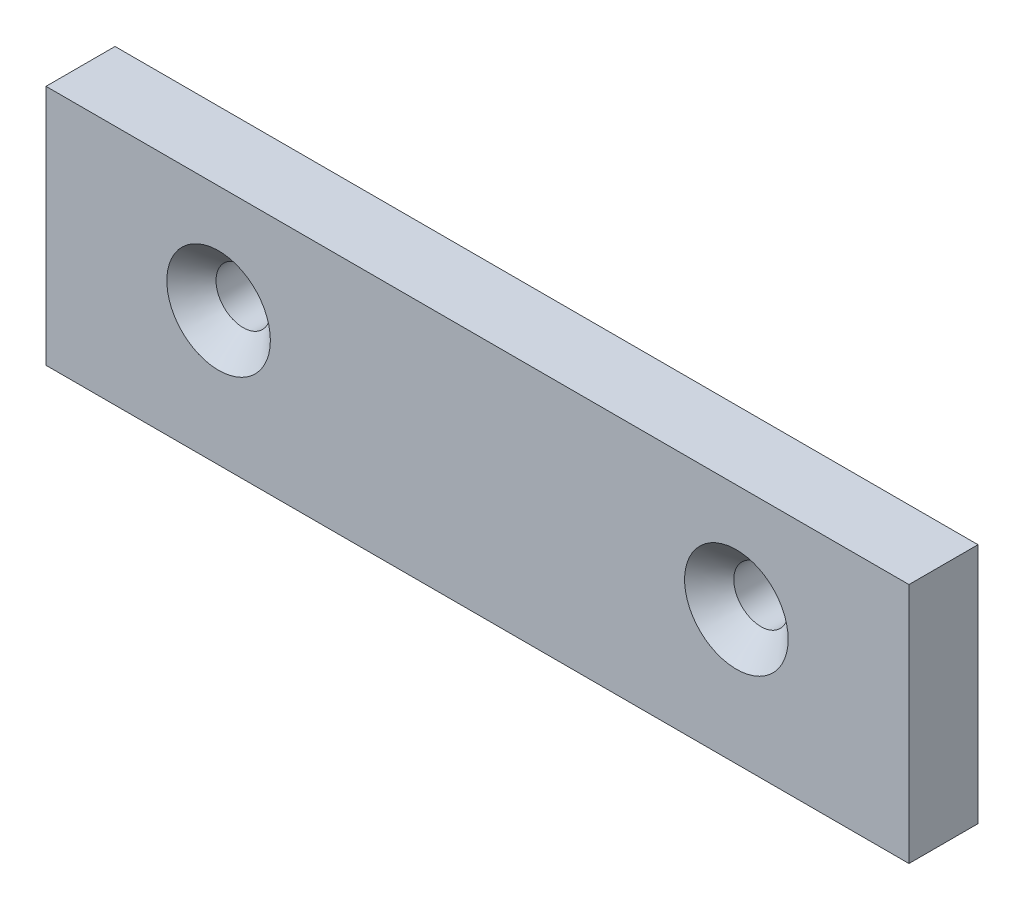
ISO-10303-21;
HEADER;
FILE_DESCRIPTION(('STEP AP214'),'2;1');
FILE_NAME('part.step','',(''),(''),'','','');
FILE_SCHEMA(('AUTOMOTIVE_DESIGN { 1 0 10303 214 1 1 1 1 }'));
ENDSEC;
DATA;
#1=APPLICATION_CONTEXT('core data for automotive mechanical design processes');
#2=APPLICATION_PROTOCOL_DEFINITION('international standard','automotive_design',2000,#1);
#3=PRODUCT_CONTEXT('',#1,'mechanical');
#4=PRODUCT('Part','Part','',(#3));
#5=PRODUCT_RELATED_PRODUCT_CATEGORY('part','',(#4));
#6=PRODUCT_DEFINITION_FORMATION('','',#4);
#7=PRODUCT_DEFINITION_CONTEXT('part definition',#1,'design');
#8=PRODUCT_DEFINITION('design','',#6,#7);
#9=PRODUCT_DEFINITION_SHAPE('','',#8);
#10=(LENGTH_UNIT() NAMED_UNIT(*) SI_UNIT(.MILLI.,.METRE.));
#11=(NAMED_UNIT(*) PLANE_ANGLE_UNIT() SI_UNIT($,.RADIAN.));
#12=(NAMED_UNIT(*) SI_UNIT($,.STERADIAN.) SOLID_ANGLE_UNIT());
#13=UNCERTAINTY_MEASURE_WITH_UNIT(LENGTH_MEASURE(1.E-05),#10,'distance_accuracy_value','');
#14=(GEOMETRIC_REPRESENTATION_CONTEXT(3) GLOBAL_UNCERTAINTY_ASSIGNED_CONTEXT((#13)) GLOBAL_UNIT_ASSIGNED_CONTEXT((#10,
#11,#12)) REPRESENTATION_CONTEXT('',''));
#15=CARTESIAN_POINT('',(0.,0.,0.));
#16=DIRECTION('',(0.,0.,1.));
#17=DIRECTION('',(1.,0.,0.));
#18=AXIS2_PLACEMENT_3D('',#15,#16,#17);
#19=CARTESIAN_POINT('',(50.,-14.,8.));
#20=DIRECTION('',(-1.,0.,0.));
#21=DIRECTION('',(0.,0.,1.));
#22=AXIS2_PLACEMENT_3D('',#19,#20,#21);
#23=PLANE('',#22);
#24=DIRECTION('',(0.,1.,0.));
#25=VECTOR('',#24,1.);
#26=CARTESIAN_POINT('',(50.,-14.,0.));
#27=LINE('',#26,#25);
#28=CARTESIAN_POINT('',(50.,-14.,0.));
#29=VERTEX_POINT('',#28);
#30=CARTESIAN_POINT('',(50.0000000000001,14.,0.));
#31=VERTEX_POINT('',#30);
#32=EDGE_CURVE('E101',#29,#31,#27,.T.);
#33=ORIENTED_EDGE('',*,*,#32,.T.);
#34=DIRECTION('',(0.,0.,-1.));
#35=VECTOR('',#34,1.);
#36=CARTESIAN_POINT('',(50.0000000000001,14.,8.));
#37=LINE('',#36,#35);
#38=CARTESIAN_POINT('',(50.0000000000001,14.,8.));
#39=VERTEX_POINT('',#38);
#40=EDGE_CURVE('E11',#39,#31,#37,.T.);
#41=ORIENTED_EDGE('',*,*,#40,.F.);
#42=DIRECTION('',(0.,1.,0.));
#43=VECTOR('',#42,1.);
#44=CARTESIAN_POINT('',(50.,-14.,8.));
#45=LINE('',#44,#43);
#46=CARTESIAN_POINT('',(50.,-14.,8.));
#47=VERTEX_POINT('',#46);
#48=EDGE_CURVE('E88',#47,#39,#45,.T.);
#49=ORIENTED_EDGE('',*,*,#48,.F.);
#50=DIRECTION('',(0.,0.,-1.));
#51=VECTOR('',#50,1.);
#52=CARTESIAN_POINT('',(50.,-14.,8.));
#53=LINE('',#52,#51);
#54=EDGE_CURVE('E97',#47,#29,#53,.T.);
#55=ORIENTED_EDGE('',*,*,#54,.T.);
#56=EDGE_LOOP('',(#33,#41,#49,#55));
#57=FACE_BOUND('',#56,.T.);
#58=ADVANCED_FACE('F35',(#57),#23,.F.);
#59=CARTESIAN_POINT('',(-50.0000000000001,14.,8.));
#60=DIRECTION('',(0.,-1.,0.));
#61=DIRECTION('',(0.,0.,-1.));
#62=AXIS2_PLACEMENT_3D('',#59,#60,#61);
#63=PLANE('',#62);
#64=DIRECTION('',(-1.,0.,0.));
#65=VECTOR('',#64,1.);
#66=CARTESIAN_POINT('',(-50.0000000000001,14.,0.));
#67=LINE('',#66,#65);
#68=CARTESIAN_POINT('',(-50.0000000000001,14.,0.));
#69=VERTEX_POINT('',#68);
#70=EDGE_CURVE('E92',#31,#69,#67,.T.);
#71=ORIENTED_EDGE('',*,*,#70,.T.);
#72=DIRECTION('',(0.,0.,-1.));
#73=VECTOR('',#72,1.);
#74=CARTESIAN_POINT('',(-50.0000000000001,14.,8.));
#75=LINE('',#74,#73);
#76=CARTESIAN_POINT('',(-50.0000000000001,14.,8.));
#77=VERTEX_POINT('',#76);
#78=EDGE_CURVE('E44',#77,#69,#75,.T.);
#79=ORIENTED_EDGE('',*,*,#78,.F.);
#80=DIRECTION('',(-1.,0.,0.));
#81=VECTOR('',#80,1.);
#82=CARTESIAN_POINT('',(-50.0000000000001,14.,8.));
#83=LINE('',#82,#81);
#84=EDGE_CURVE('E83',#39,#77,#83,.T.);
#85=ORIENTED_EDGE('',*,*,#84,.F.);
#86=ORIENTED_EDGE('',*,*,#40,.T.);
#87=EDGE_LOOP('',(#71,#79,#85,#86));
#88=FACE_BOUND('',#87,.T.);
#89=ADVANCED_FACE('F91',(#88),#63,.F.);
#90=CARTESIAN_POINT('',(-50.0000000000001,-14.,8.));
#91=DIRECTION('',(1.,0.,0.));
#92=DIRECTION('',(0.,0.,-1.));
#93=AXIS2_PLACEMENT_3D('',#90,#91,#92);
#94=PLANE('',#93);
#95=DIRECTION('',(0.,-1.,0.));
#96=VECTOR('',#95,1.);
#97=CARTESIAN_POINT('',(-50.0000000000001,-14.,0.));
#98=LINE('',#97,#96);
#99=CARTESIAN_POINT('',(-50.0000000000001,-14.,0.));
#100=VERTEX_POINT('',#99);
#101=EDGE_CURVE('E70',#69,#100,#98,.T.);
#102=ORIENTED_EDGE('',*,*,#101,.T.);
#103=DIRECTION('',(0.,0.,-1.));
#104=VECTOR('',#103,1.);
#105=CARTESIAN_POINT('',(-50.0000000000001,-14.,8.));
#106=LINE('',#105,#104);
#107=CARTESIAN_POINT('',(-50.0000000000001,-14.,8.));
#108=VERTEX_POINT('',#107);
#109=EDGE_CURVE('E93',#108,#100,#106,.T.);
#110=ORIENTED_EDGE('',*,*,#109,.F.);
#111=DIRECTION('',(0.,-1.,0.));
#112=VECTOR('',#111,1.);
#113=CARTESIAN_POINT('',(-50.0000000000001,-14.,8.));
#114=LINE('',#113,#112);
#115=EDGE_CURVE('E86',#77,#108,#114,.T.);
#116=ORIENTED_EDGE('',*,*,#115,.F.);
#117=ORIENTED_EDGE('',*,*,#78,.T.);
#118=EDGE_LOOP('',(#102,#110,#116,#117));
#119=FACE_BOUND('',#118,.T.);
#120=ADVANCED_FACE('F95',(#119),#94,.F.);
#121=CARTESIAN_POINT('',(-50.0000000000001,-14.,8.));
#122=DIRECTION('',(0.,1.,0.));
#123=DIRECTION('',(0.,0.,1.));
#124=AXIS2_PLACEMENT_3D('',#121,#122,#123);
#125=PLANE('',#124);
#126=DIRECTION('',(1.,0.,0.));
#127=VECTOR('',#126,1.);
#128=CARTESIAN_POINT('',(-50.0000000000001,-14.,0.));
#129=LINE('',#128,#127);
#130=EDGE_CURVE('E76',#100,#29,#129,.T.);
#131=ORIENTED_EDGE('',*,*,#130,.T.);
#132=ORIENTED_EDGE('',*,*,#54,.F.);
#133=DIRECTION('',(1.,0.,0.));
#134=VECTOR('',#133,1.);
#135=CARTESIAN_POINT('',(-50.0000000000001,-14.,8.));
#136=LINE('',#135,#134);
#137=EDGE_CURVE('E53',#108,#47,#136,.T.);
#138=ORIENTED_EDGE('',*,*,#137,.F.);
#139=ORIENTED_EDGE('',*,*,#109,.T.);
#140=EDGE_LOOP('',(#131,#132,#138,#139));
#141=FACE_BOUND('',#140,.T.);
#142=ADVANCED_FACE('F133',(#141),#125,.F.);
#143=CARTESIAN_POINT('',(0.,0.,8.));
#144=DIRECTION('',(0.,0.,-1.));
#145=DIRECTION('',(-1.,0.,0.));
#146=AXIS2_PLACEMENT_3D('',#143,#144,#145);
#147=PLANE('',#146);
#148=CARTESIAN_POINT('',(-30.,1.5,8.));
#149=DIRECTION('',(0.,0.,1.));
#150=DIRECTION('',(1.,0.,0.));
#151=AXIS2_PLACEMENT_3D('',#148,#149,#150);
#152=CIRCLE('',#151,6.);
#153=CARTESIAN_POINT('',(-24.,1.5,8.));
#154=VERTEX_POINT('',#153);
#155=EDGE_CURVE('E124',#154,#154,#152,.T.);
#156=ORIENTED_EDGE('',*,*,#155,.F.);
#157=EDGE_LOOP('',(#156));
#158=FACE_BOUND('',#157,.T.);
#159=CARTESIAN_POINT('',(30.0000000000001,1.50000000000008,8.));
#160=DIRECTION('',(0.,0.,1.));
#161=DIRECTION('',(1.,0.,0.));
#162=AXIS2_PLACEMENT_3D('',#159,#160,#161);
#163=CIRCLE('',#162,6.);
#164=CARTESIAN_POINT('',(36.0000000000001,1.50000000000008,8.));
#165=VERTEX_POINT('',#164);
#166=EDGE_CURVE('E114',#165,#165,#163,.T.);
#167=ORIENTED_EDGE('',*,*,#166,.F.);
#168=EDGE_LOOP('',(#167));
#169=FACE_BOUND('',#168,.T.);
#170=ORIENTED_EDGE('',*,*,#48,.T.);
#171=ORIENTED_EDGE('',*,*,#84,.T.);
#172=ORIENTED_EDGE('',*,*,#115,.T.);
#173=ORIENTED_EDGE('',*,*,#137,.T.);
#174=EDGE_LOOP('',(#170,#171,#172,#173));
#175=FACE_BOUND('',#174,.T.);
#176=ADVANCED_FACE('F84',(#158,#169,#175),#147,.F.);
#177=CARTESIAN_POINT('',(0.,0.,0.));
#178=DIRECTION('',(0.,0.,-1.));
#179=DIRECTION('',(-1.,0.,0.));
#180=AXIS2_PLACEMENT_3D('',#177,#178,#179);
#181=PLANE('',#180);
#182=CARTESIAN_POINT('',(-30.,1.5,0.));
#183=DIRECTION('',(0.,0.,-1.));
#184=DIRECTION('',(-1.,0.,0.));
#185=AXIS2_PLACEMENT_3D('',#182,#183,#184);
#186=CIRCLE('',#185,3.15);
#187=CARTESIAN_POINT('',(-33.15,1.5,0.));
#188=VERTEX_POINT('',#187);
#189=EDGE_CURVE('E38',#188,#188,#186,.T.);
#190=ORIENTED_EDGE('',*,*,#189,.F.);
#191=EDGE_LOOP('',(#190));
#192=FACE_BOUND('',#191,.T.);
#193=CARTESIAN_POINT('',(30.0000000000001,1.50000000000008,0.));
#194=DIRECTION('',(0.,0.,-1.));
#195=DIRECTION('',(-1.,0.,0.));
#196=AXIS2_PLACEMENT_3D('',#193,#194,#195);
#197=CIRCLE('',#196,3.15);
#198=CARTESIAN_POINT('',(26.85,1.50000000000008,0.));
#199=VERTEX_POINT('',#198);
#200=EDGE_CURVE('E104',#199,#199,#197,.T.);
#201=ORIENTED_EDGE('',*,*,#200,.F.);
#202=EDGE_LOOP('',(#201));
#203=FACE_BOUND('',#202,.T.);
#204=ORIENTED_EDGE('',*,*,#32,.F.);
#205=ORIENTED_EDGE('',*,*,#130,.F.);
#206=ORIENTED_EDGE('',*,*,#101,.F.);
#207=ORIENTED_EDGE('',*,*,#70,.F.);
#208=EDGE_LOOP('',(#204,#205,#206,#207));
#209=FACE_BOUND('',#208,.T.);
#210=ADVANCED_FACE('F132',(#192,#203,#209),#181,.T.);
#211=CARTESIAN_POINT('',(30.0000000000001,1.50000000000008,8.));
#212=DIRECTION('',(0.,0.,1.));
#213=DIRECTION('',(1.,0.,0.));
#214=AXIS2_PLACEMENT_3D('',#211,#212,#213);
#215=CYLINDRICAL_SURFACE('',#214,3.15);
#216=ORIENTED_EDGE('',*,*,#200,.T.);
#217=EDGE_LOOP('',(#216));
#218=FACE_BOUND('',#217,.T.);
#219=CARTESIAN_POINT('',(30.0000000000001,1.50000000000008,5.15000000000001));
#220=DIRECTION('',(0.,0.,1.));
#221=DIRECTION('',(1.,0.,0.));
#222=AXIS2_PLACEMENT_3D('',#219,#220,#221);
#223=CIRCLE('',#222,3.15);
#224=CARTESIAN_POINT('',(33.1500000000001,1.50000000000008,5.15000000000001));
#225=VERTEX_POINT('',#224);
#226=EDGE_CURVE('E110',#225,#225,#223,.T.);
#227=ORIENTED_EDGE('',*,*,#226,.T.);
#228=EDGE_LOOP('',(#227));
#229=FACE_BOUND('',#228,.T.);
#230=ADVANCED_FACE('F140',(#218,#229),#215,.F.);
#231=CARTESIAN_POINT('',(30.0000000000001,1.50000000000008,8.));
#232=DIRECTION('',(0.,0.,1.));
#233=DIRECTION('',(1.,0.,0.));
#234=AXIS2_PLACEMENT_3D('',#231,#232,#233);
#235=CONICAL_SURFACE('',#234,6.,0.785398163397449);
#236=ORIENTED_EDGE('',*,*,#226,.F.);
#237=EDGE_LOOP('',(#236));
#238=FACE_BOUND('',#237,.T.);
#239=ORIENTED_EDGE('',*,*,#166,.T.);
#240=EDGE_LOOP('',(#239));
#241=FACE_BOUND('',#240,.T.);
#242=ADVANCED_FACE('F137',(#238,#241),#235,.F.);
#243=CARTESIAN_POINT('',(-30.,1.5,8.));
#244=DIRECTION('',(0.,0.,1.));
#245=DIRECTION('',(1.,0.,0.));
#246=AXIS2_PLACEMENT_3D('',#243,#244,#245);
#247=CYLINDRICAL_SURFACE('',#246,3.15);
#248=ORIENTED_EDGE('',*,*,#189,.T.);
#249=EDGE_LOOP('',(#248));
#250=FACE_BOUND('',#249,.T.);
#251=CARTESIAN_POINT('',(-30.,1.5,5.15000000000001));
#252=DIRECTION('',(0.,0.,1.));
#253=DIRECTION('',(1.,0.,0.));
#254=AXIS2_PLACEMENT_3D('',#251,#252,#253);
#255=CIRCLE('',#254,3.15000000000001);
#256=CARTESIAN_POINT('',(-26.85,1.5,5.15000000000001));
#257=VERTEX_POINT('',#256);
#258=EDGE_CURVE('E121',#257,#257,#255,.T.);
#259=ORIENTED_EDGE('',*,*,#258,.T.);
#260=EDGE_LOOP('',(#259));
#261=FACE_BOUND('',#260,.T.);
#262=ADVANCED_FACE('F139',(#250,#261),#247,.F.);
#263=CARTESIAN_POINT('',(-30.,1.5,8.));
#264=DIRECTION('',(0.,0.,1.));
#265=DIRECTION('',(1.,0.,0.));
#266=AXIS2_PLACEMENT_3D('',#263,#264,#265);
#267=CONICAL_SURFACE('',#266,6.,0.785398163397449);
#268=ORIENTED_EDGE('',*,*,#258,.F.);
#269=EDGE_LOOP('',(#268));
#270=FACE_BOUND('',#269,.T.);
#271=ORIENTED_EDGE('',*,*,#155,.T.);
#272=EDGE_LOOP('',(#271));
#273=FACE_BOUND('',#272,.T.);
#274=ADVANCED_FACE('F128',(#270,#273),#267,.F.);
#275=CLOSED_SHELL('',(#58,#89,#120,#142,#176,#210,#230,#242,#262,#274));
#276=MANIFOLD_SOLID_BREP('B2',#275);
#277=ADVANCED_BREP_SHAPE_REPRESENTATION('',(#18,#276),#14);
#278=SHAPE_DEFINITION_REPRESENTATION(#9,#277);
ENDSEC;
END-ISO-10303-21;
